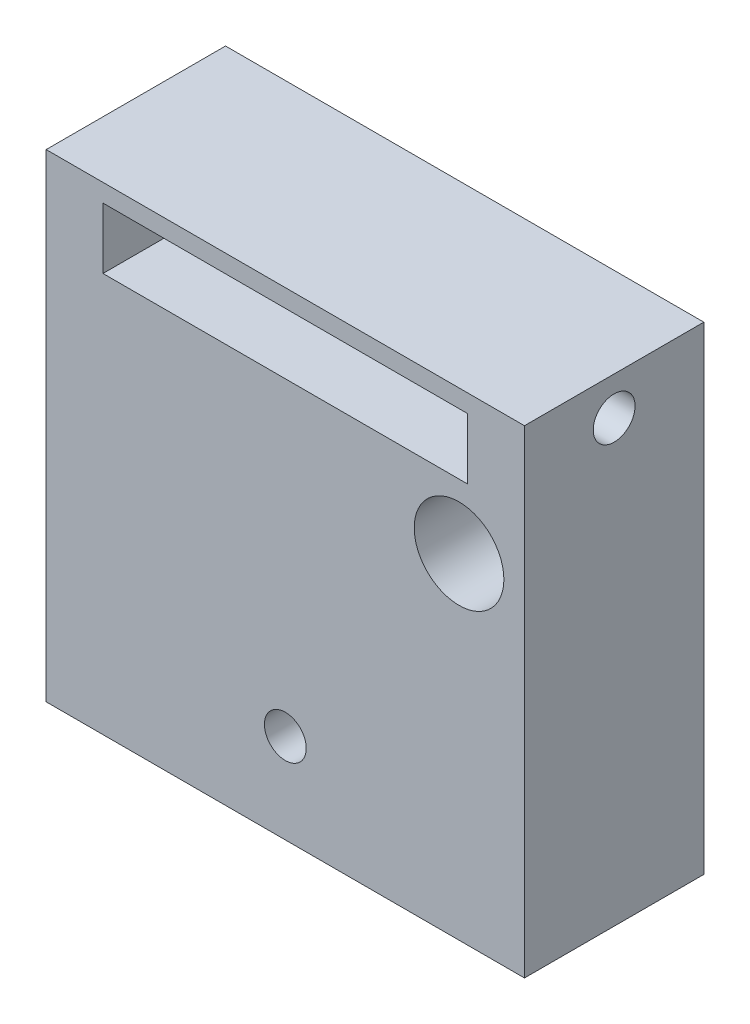
ISO-10303-21;
HEADER;
FILE_DESCRIPTION(('STEP AP214'),'2;1');
FILE_NAME('part.step','',(''),(''),'','','');
FILE_SCHEMA(('AUTOMOTIVE_DESIGN { 1 0 10303 214 1 1 1 1 }'));
ENDSEC;
DATA;
#1=APPLICATION_CONTEXT('core data for automotive mechanical design processes');
#2=APPLICATION_PROTOCOL_DEFINITION('international standard','automotive_design',2000,#1);
#3=PRODUCT_CONTEXT('',#1,'mechanical');
#4=PRODUCT('Part','Part','',(#3));
#5=PRODUCT_RELATED_PRODUCT_CATEGORY('part','',(#4));
#6=PRODUCT_DEFINITION_FORMATION('','',#4);
#7=PRODUCT_DEFINITION_CONTEXT('part definition',#1,'design');
#8=PRODUCT_DEFINITION('design','',#6,#7);
#9=PRODUCT_DEFINITION_SHAPE('','',#8);
#10=(LENGTH_UNIT() NAMED_UNIT(*) SI_UNIT(.MILLI.,.METRE.));
#11=(NAMED_UNIT(*) PLANE_ANGLE_UNIT() SI_UNIT($,.RADIAN.));
#12=(NAMED_UNIT(*) SI_UNIT($,.STERADIAN.) SOLID_ANGLE_UNIT());
#13=UNCERTAINTY_MEASURE_WITH_UNIT(LENGTH_MEASURE(1.E-05),#10,'distance_accuracy_value','');
#14=(GEOMETRIC_REPRESENTATION_CONTEXT(3) GLOBAL_UNCERTAINTY_ASSIGNED_CONTEXT((#13)) GLOBAL_UNIT_ASSIGNED_CONTEXT((#10,
#11,#12)) REPRESENTATION_CONTEXT('',''));
#15=CARTESIAN_POINT('',(0.,0.,0.));
#16=DIRECTION('',(0.,0.,1.));
#17=DIRECTION('',(1.,0.,0.));
#18=AXIS2_PLACEMENT_3D('',#15,#16,#17);
#19=CARTESIAN_POINT('',(-30.5,37.,0.));
#20=DIRECTION('',(0.,1.,0.));
#21=DIRECTION('',(0.,0.,1.));
#22=AXIS2_PLACEMENT_3D('',#19,#20,#21);
#23=PLANE('',#22);
#24=DIRECTION('',(0.,0.,1.));
#25=VECTOR('',#24,1.);
#26=CARTESIAN_POINT('',(-30.5,37.,0.));
#27=LINE('',#26,#25);
#28=CARTESIAN_POINT('',(-30.5,37.,15.904962139842));
#29=VERTEX_POINT('',#28);
#30=CARTESIAN_POINT('',(-30.5,37.,30.));
#31=VERTEX_POINT('',#30);
#32=EDGE_CURVE('E156',#29,#31,#27,.T.);
#33=ORIENTED_EDGE('',*,*,#32,.F.);
#34=DIRECTION('',(1.,0.,0.));
#35=VECTOR('',#34,1.);
#36=CARTESIAN_POINT('',(-40.,37.,15.904962139842));
#37=LINE('',#36,#35);
#38=CARTESIAN_POINT('',(30.5,37.,15.904962139842));
#39=VERTEX_POINT('',#38);
#40=EDGE_CURVE('E11',#29,#39,#37,.T.);
#41=ORIENTED_EDGE('',*,*,#40,.T.);
#42=DIRECTION('',(0.,0.,1.));
#43=VECTOR('',#42,1.);
#44=CARTESIAN_POINT('',(30.5,37.,0.));
#45=LINE('',#44,#43);
#46=CARTESIAN_POINT('',(30.5,37.,30.));
#47=VERTEX_POINT('',#46);
#48=EDGE_CURVE('E149',#39,#47,#45,.T.);
#49=ORIENTED_EDGE('',*,*,#48,.T.);
#50=DIRECTION('',(-1.,0.,0.));
#51=VECTOR('',#50,1.);
#52=CARTESIAN_POINT('',(-30.5,37.,30.));
#53=LINE('',#52,#51);
#54=EDGE_CURVE('E340',#47,#31,#53,.T.);
#55=ORIENTED_EDGE('',*,*,#54,.T.);
#56=EDGE_LOOP('',(#33,#41,#49,#55));
#57=FACE_BOUND('',#56,.T.);
#58=ADVANCED_FACE('F35',(#57),#23,.F.);
#59=CARTESIAN_POINT('',(40.,-40.,30.));
#60=DIRECTION('',(-1.,0.,0.));
#61=DIRECTION('',(0.,0.,1.));
#62=AXIS2_PLACEMENT_3D('',#59,#60,#61);
#63=PLANE('',#62);
#64=CARTESIAN_POINT('',(40.,33.6190173727964,15.));
#65=DIRECTION('',(1.,0.,0.));
#66=DIRECTION('',(0.,0.,-1.));
#67=AXIS2_PLACEMENT_3D('',#64,#65,#66);
#68=CIRCLE('',#67,3.5);
#69=CARTESIAN_POINT('',(40.,33.6190173727964,11.5));
#70=VERTEX_POINT('',#69);
#71=EDGE_CURVE('E288',#70,#70,#68,.T.);
#72=ORIENTED_EDGE('',*,*,#71,.F.);
#73=EDGE_LOOP('',(#72));
#74=FACE_BOUND('',#73,.T.);
#75=DIRECTION('',(0.,1.,0.));
#76=VECTOR('',#75,1.);
#77=CARTESIAN_POINT('',(40.,-40.,0.));
#78=LINE('',#77,#76);
#79=CARTESIAN_POINT('',(40.,-40.,0.));
#80=VERTEX_POINT('',#79);
#81=CARTESIAN_POINT('',(40.,40.,0.));
#82=VERTEX_POINT('',#81);
#83=EDGE_CURVE('E174',#80,#82,#78,.T.);
#84=ORIENTED_EDGE('',*,*,#83,.T.);
#85=DIRECTION('',(0.,0.,-1.));
#86=VECTOR('',#85,1.);
#87=CARTESIAN_POINT('',(40.,40.,30.));
#88=LINE('',#87,#86);
#89=CARTESIAN_POINT('',(40.,40.,30.));
#90=VERTEX_POINT('',#89);
#91=EDGE_CURVE('E141',#90,#82,#88,.T.);
#92=ORIENTED_EDGE('',*,*,#91,.F.);
#93=DIRECTION('',(0.,1.,0.));
#94=VECTOR('',#93,1.);
#95=CARTESIAN_POINT('',(40.,-40.,30.));
#96=LINE('',#95,#94);
#97=CARTESIAN_POINT('',(40.,-40.,30.));
#98=VERTEX_POINT('',#97);
#99=EDGE_CURVE('E163',#98,#90,#96,.T.);
#100=ORIENTED_EDGE('',*,*,#99,.F.);
#101=DIRECTION('',(0.,0.,-1.));
#102=VECTOR('',#101,1.);
#103=CARTESIAN_POINT('',(40.,-40.,30.));
#104=LINE('',#103,#102);
#105=EDGE_CURVE('E173',#98,#80,#104,.T.);
#106=ORIENTED_EDGE('',*,*,#105,.T.);
#107=EDGE_LOOP('',(#84,#92,#100,#106));
#108=FACE_BOUND('',#107,.T.);
#109=ADVANCED_FACE('F37',(#74,#108),#63,.F.);
#110=CARTESIAN_POINT('',(-40.,40.,30.));
#111=DIRECTION('',(0.,-1.,0.));
#112=DIRECTION('',(0.,0.,-1.));
#113=AXIS2_PLACEMENT_3D('',#110,#111,#112);
#114=PLANE('',#113);
#115=DIRECTION('',(-1.,0.,0.));
#116=VECTOR('',#115,1.);
#117=CARTESIAN_POINT('',(-40.,40.,0.));
#118=LINE('',#117,#116);
#119=CARTESIAN_POINT('',(-40.,40.,0.));
#120=VERTEX_POINT('',#119);
#121=EDGE_CURVE('E177',#82,#120,#118,.T.);
#122=ORIENTED_EDGE('',*,*,#121,.T.);
#123=DIRECTION('',(0.,0.,-1.));
#124=VECTOR('',#123,1.);
#125=CARTESIAN_POINT('',(-40.,40.,30.));
#126=LINE('',#125,#124);
#127=CARTESIAN_POINT('',(-40.,40.,30.));
#128=VERTEX_POINT('',#127);
#129=EDGE_CURVE('E190',#128,#120,#126,.T.);
#130=ORIENTED_EDGE('',*,*,#129,.F.);
#131=DIRECTION('',(-1.,0.,0.));
#132=VECTOR('',#131,1.);
#133=CARTESIAN_POINT('',(-40.,40.,30.));
#134=LINE('',#133,#132);
#135=EDGE_CURVE('E166',#90,#128,#134,.T.);
#136=ORIENTED_EDGE('',*,*,#135,.F.);
#137=ORIENTED_EDGE('',*,*,#91,.T.);
#138=EDGE_LOOP('',(#122,#130,#136,#137));
#139=FACE_BOUND('',#138,.T.);
#140=ADVANCED_FACE('F196',(#139),#114,.F.);
#141=CARTESIAN_POINT('',(-40.,-40.,30.));
#142=DIRECTION('',(1.,0.,0.));
#143=DIRECTION('',(0.,0.,-1.));
#144=AXIS2_PLACEMENT_3D('',#141,#142,#143);
#145=PLANE('',#144);
#146=CARTESIAN_POINT('',(-40.,33.6190173727964,15.));
#147=DIRECTION('',(1.,0.,0.));
#148=DIRECTION('',(0.,0.,-1.));
#149=AXIS2_PLACEMENT_3D('',#146,#147,#148);
#150=CIRCLE('',#149,3.5);
#151=CARTESIAN_POINT('',(-40.,33.6190173727964,11.5));
#152=VERTEX_POINT('',#151);
#153=EDGE_CURVE('E291',#152,#152,#150,.T.);
#154=ORIENTED_EDGE('',*,*,#153,.T.);
#155=EDGE_LOOP('',(#154));
#156=FACE_BOUND('',#155,.T.);
#157=DIRECTION('',(0.,-1.,0.));
#158=VECTOR('',#157,1.);
#159=CARTESIAN_POINT('',(-40.,-40.,0.));
#160=LINE('',#159,#158);
#161=CARTESIAN_POINT('',(-40.,-40.,0.));
#162=VERTEX_POINT('',#161);
#163=EDGE_CURVE('E180',#120,#162,#160,.T.);
#164=ORIENTED_EDGE('',*,*,#163,.T.);
#165=DIRECTION('',(0.,0.,-1.));
#166=VECTOR('',#165,1.);
#167=CARTESIAN_POINT('',(-40.,-40.,30.));
#168=LINE('',#167,#166);
#169=CARTESIAN_POINT('',(-40.,-40.,30.));
#170=VERTEX_POINT('',#169);
#171=EDGE_CURVE('E187',#170,#162,#168,.T.);
#172=ORIENTED_EDGE('',*,*,#171,.F.);
#173=DIRECTION('',(0.,-1.,0.));
#174=VECTOR('',#173,1.);
#175=CARTESIAN_POINT('',(-40.,-40.,30.));
#176=LINE('',#175,#174);
#177=EDGE_CURVE('E169',#128,#170,#176,.T.);
#178=ORIENTED_EDGE('',*,*,#177,.F.);
#179=ORIENTED_EDGE('',*,*,#129,.T.);
#180=EDGE_LOOP('',(#164,#172,#178,#179));
#181=FACE_BOUND('',#180,.T.);
#182=ADVANCED_FACE('F211',(#156,#181),#145,.F.);
#183=CARTESIAN_POINT('',(-40.,-40.,30.));
#184=DIRECTION('',(0.,1.,0.));
#185=DIRECTION('',(0.,0.,1.));
#186=AXIS2_PLACEMENT_3D('',#183,#184,#185);
#187=PLANE('',#186);
#188=DIRECTION('',(-1.,0.,0.));
#189=VECTOR('',#188,1.);
#190=CARTESIAN_POINT('',(20.,-40.,20.));
#191=LINE('',#190,#189);
#192=CARTESIAN_POINT('',(20.,-40.,20.));
#193=VERTEX_POINT('',#192);
#194=CARTESIAN_POINT('',(-20.,-40.,20.));
#195=VERTEX_POINT('',#194);
#196=EDGE_CURVE('E306',#193,#195,#191,.T.);
#197=ORIENTED_EDGE('',*,*,#196,.F.);
#198=DIRECTION('',(0.,0.,-1.));
#199=VECTOR('',#198,1.);
#200=CARTESIAN_POINT('',(20.,-40.,20.));
#201=LINE('',#200,#199);
#202=CARTESIAN_POINT('',(20.,-40.,0.));
#203=VERTEX_POINT('',#202);
#204=EDGE_CURVE('E316',#193,#203,#201,.T.);
#205=ORIENTED_EDGE('',*,*,#204,.T.);
#206=DIRECTION('',(1.,0.,0.));
#207=VECTOR('',#206,1.);
#208=CARTESIAN_POINT('',(-40.,-40.,0.));
#209=LINE('',#208,#207);
#210=EDGE_CURVE('E182',#203,#80,#209,.T.);
#211=ORIENTED_EDGE('',*,*,#210,.T.);
#212=ORIENTED_EDGE('',*,*,#105,.F.);
#213=DIRECTION('',(1.,0.,0.));
#214=VECTOR('',#213,1.);
#215=CARTESIAN_POINT('',(-40.,-40.,30.));
#216=LINE('',#215,#214);
#217=EDGE_CURVE('E171',#170,#98,#216,.T.);
#218=ORIENTED_EDGE('',*,*,#217,.F.);
#219=ORIENTED_EDGE('',*,*,#171,.T.);
#220=CARTESIAN_POINT('',(-20.,-40.,0.));
#221=VERTEX_POINT('',#220);
#222=EDGE_CURVE('E167',#162,#221,#209,.T.);
#223=ORIENTED_EDGE('',*,*,#222,.T.);
#224=DIRECTION('',(0.,0.,-1.));
#225=VECTOR('',#224,1.);
#226=CARTESIAN_POINT('',(-20.,-40.,20.));
#227=LINE('',#226,#225);
#228=EDGE_CURVE('E58',#195,#221,#227,.T.);
#229=ORIENTED_EDGE('',*,*,#228,.F.);
#230=EDGE_LOOP('',(#197,#205,#211,#212,#218,#219,#223,#229));
#231=FACE_BOUND('',#230,.T.);
#232=ADVANCED_FACE('F216',(#231),#187,.F.);
#233=CARTESIAN_POINT('',(0.,0.,30.));
#234=DIRECTION('',(0.,0.,-1.));
#235=DIRECTION('',(-1.,0.,0.));
#236=AXIS2_PLACEMENT_3D('',#233,#234,#235);
#237=PLANE('',#236);
#238=CARTESIAN_POINT('',(29.0563125975893,16.,30.));
#239=DIRECTION('',(0.,0.,1.));
#240=DIRECTION('',(1.,0.,0.));
#241=AXIS2_PLACEMENT_3D('',#238,#239,#240);
#242=CIRCLE('',#241,7.5);
#243=CARTESIAN_POINT('',(36.5563125975893,16.,30.));
#244=VERTEX_POINT('',#243);
#245=EDGE_CURVE('E286',#244,#244,#242,.T.);
#246=ORIENTED_EDGE('',*,*,#245,.F.);
#247=EDGE_LOOP('',(#246));
#248=FACE_BOUND('',#247,.T.);
#249=CARTESIAN_POINT('',(0.,-25.,30.));
#250=DIRECTION('',(0.,0.,-1.));
#251=DIRECTION('',(-1.,0.,0.));
#252=AXIS2_PLACEMENT_3D('',#249,#250,#251);
#253=CIRCLE('',#252,3.5);
#254=CARTESIAN_POINT('',(-3.49999999999999,-25.,30.));
#255=VERTEX_POINT('',#254);
#256=EDGE_CURVE('E297',#255,#255,#253,.T.);
#257=ORIENTED_EDGE('',*,*,#256,.T.);
#258=EDGE_LOOP('',(#257));
#259=FACE_BOUND('',#258,.T.);
#260=ORIENTED_EDGE('',*,*,#54,.F.);
#261=DIRECTION('',(0.,1.,0.));
#262=VECTOR('',#261,1.);
#263=CARTESIAN_POINT('',(30.5,26.8,30.));
#264=LINE('',#263,#262);
#265=CARTESIAN_POINT('',(30.5,26.8,30.));
#266=VERTEX_POINT('',#265);
#267=EDGE_CURVE('E324',#266,#47,#264,.T.);
#268=ORIENTED_EDGE('',*,*,#267,.F.);
#269=DIRECTION('',(1.,0.,0.));
#270=VECTOR('',#269,1.);
#271=CARTESIAN_POINT('',(-30.5,26.8,30.));
#272=LINE('',#271,#270);
#273=CARTESIAN_POINT('',(-30.5,26.8,30.));
#274=VERTEX_POINT('',#273);
#275=EDGE_CURVE('E332',#274,#266,#272,.T.);
#276=ORIENTED_EDGE('',*,*,#275,.F.);
#277=DIRECTION('',(0.,-1.,0.));
#278=VECTOR('',#277,1.);
#279=CARTESIAN_POINT('',(-30.5,26.8,30.));
#280=LINE('',#279,#278);
#281=EDGE_CURVE('E343',#31,#274,#280,.T.);
#282=ORIENTED_EDGE('',*,*,#281,.F.);
#283=EDGE_LOOP('',(#260,#268,#276,#282));
#284=FACE_BOUND('',#283,.T.);
#285=ORIENTED_EDGE('',*,*,#99,.T.);
#286=ORIENTED_EDGE('',*,*,#135,.T.);
#287=ORIENTED_EDGE('',*,*,#177,.T.);
#288=ORIENTED_EDGE('',*,*,#217,.T.);
#289=EDGE_LOOP('',(#285,#286,#287,#288));
#290=FACE_BOUND('',#289,.T.);
#291=ADVANCED_FACE('F218',(#248,#259,#284,#290),#237,.F.);
#292=CARTESIAN_POINT('',(0.,0.,0.));
#293=DIRECTION('',(0.,0.,-1.));
#294=DIRECTION('',(-1.,0.,0.));
#295=AXIS2_PLACEMENT_3D('',#292,#293,#294);
#296=PLANE('',#295);
#297=CARTESIAN_POINT('',(29.0563125975893,16.,0.));
#298=DIRECTION('',(0.,0.,1.));
#299=DIRECTION('',(1.,0.,0.));
#300=AXIS2_PLACEMENT_3D('',#297,#298,#299);
#301=CIRCLE('',#300,7.5);
#302=CARTESIAN_POINT('',(36.5563125975893,16.,0.));
#303=VERTEX_POINT('',#302);
#304=EDGE_CURVE('E284',#303,#303,#301,.T.);
#305=ORIENTED_EDGE('',*,*,#304,.T.);
#306=EDGE_LOOP('',(#305));
#307=FACE_BOUND('',#306,.T.);
#308=DIRECTION('',(0.,-1.,0.));
#309=VECTOR('',#308,1.);
#310=CARTESIAN_POINT('',(20.,-40.,0.));
#311=LINE('',#310,#309);
#312=CARTESIAN_POINT('',(20.,-15.,0.));
#313=VERTEX_POINT('',#312);
#314=EDGE_CURVE('E300',#313,#203,#311,.T.);
#315=ORIENTED_EDGE('',*,*,#314,.F.);
#316=DIRECTION('',(1.,0.,0.));
#317=VECTOR('',#316,1.);
#318=CARTESIAN_POINT('',(20.,-15.,0.));
#319=LINE('',#318,#317);
#320=CARTESIAN_POINT('',(-20.,-15.,0.));
#321=VERTEX_POINT('',#320);
#322=EDGE_CURVE('E307',#321,#313,#319,.T.);
#323=ORIENTED_EDGE('',*,*,#322,.F.);
#324=DIRECTION('',(0.,1.,0.));
#325=VECTOR('',#324,1.);
#326=CARTESIAN_POINT('',(-20.,-40.,0.));
#327=LINE('',#326,#325);
#328=EDGE_CURVE('E318',#221,#321,#327,.T.);
#329=ORIENTED_EDGE('',*,*,#328,.F.);
#330=ORIENTED_EDGE('',*,*,#222,.F.);
#331=ORIENTED_EDGE('',*,*,#163,.F.);
#332=ORIENTED_EDGE('',*,*,#121,.F.);
#333=ORIENTED_EDGE('',*,*,#83,.F.);
#334=ORIENTED_EDGE('',*,*,#210,.F.);
#335=EDGE_LOOP('',(#315,#323,#329,#330,#331,#332,#333,#334));
#336=FACE_BOUND('',#335,.T.);
#337=DIRECTION('',(0.,1.,0.));
#338=VECTOR('',#337,1.);
#339=CARTESIAN_POINT('',(30.5,26.8,0.));
#340=LINE('',#339,#338);
#341=CARTESIAN_POINT('',(30.5,26.8,0.));
#342=VERTEX_POINT('',#341);
#343=CARTESIAN_POINT('',(30.5,37.,0.));
#344=VERTEX_POINT('',#343);
#345=EDGE_CURVE('E330',#342,#344,#340,.T.);
#346=ORIENTED_EDGE('',*,*,#345,.T.);
#347=DIRECTION('',(-1.,0.,0.));
#348=VECTOR('',#347,1.);
#349=CARTESIAN_POINT('',(-30.5,37.,0.));
#350=LINE('',#349,#348);
#351=CARTESIAN_POINT('',(-30.5,37.,0.));
#352=VERTEX_POINT('',#351);
#353=EDGE_CURVE('E154',#344,#352,#350,.T.);
#354=ORIENTED_EDGE('',*,*,#353,.T.);
#355=DIRECTION('',(0.,-1.,0.));
#356=VECTOR('',#355,1.);
#357=CARTESIAN_POINT('',(-30.5,26.8,0.));
#358=LINE('',#357,#356);
#359=CARTESIAN_POINT('',(-30.5,26.8,0.));
#360=VERTEX_POINT('',#359);
#361=EDGE_CURVE('E334',#352,#360,#358,.T.);
#362=ORIENTED_EDGE('',*,*,#361,.T.);
#363=DIRECTION('',(1.,0.,0.));
#364=VECTOR('',#363,1.);
#365=CARTESIAN_POINT('',(-30.5,26.8,0.));
#366=LINE('',#365,#364);
#367=EDGE_CURVE('E160',#360,#342,#366,.T.);
#368=ORIENTED_EDGE('',*,*,#367,.T.);
#369=EDGE_LOOP('',(#346,#354,#362,#368));
#370=FACE_BOUND('',#369,.T.);
#371=ADVANCED_FACE('F205',(#307,#336,#370),#296,.T.);
#372=CARTESIAN_POINT('',(30.5,26.8,0.));
#373=DIRECTION('',(1.,0.,0.));
#374=DIRECTION('',(0.,0.,-1.));
#375=AXIS2_PLACEMENT_3D('',#372,#373,#374);
#376=PLANE('',#375);
#377=ORIENTED_EDGE('',*,*,#48,.F.);
#378=CARTESIAN_POINT('',(30.5,33.6190173727964,15.));
#379=DIRECTION('',(1.,0.,0.));
#380=DIRECTION('',(0.,0.,-1.));
#381=AXIS2_PLACEMENT_3D('',#378,#379,#380);
#382=CIRCLE('',#381,3.5);
#383=CARTESIAN_POINT('',(30.5,37.,14.095037860158));
#384=VERTEX_POINT('',#383);
#385=EDGE_CURVE('E136',#39,#384,#382,.T.);
#386=ORIENTED_EDGE('',*,*,#385,.T.);
#387=EDGE_CURVE('E146',#344,#384,#45,.T.);
#388=ORIENTED_EDGE('',*,*,#387,.F.);
#389=ORIENTED_EDGE('',*,*,#345,.F.);
#390=DIRECTION('',(0.,0.,1.));
#391=VECTOR('',#390,1.);
#392=CARTESIAN_POINT('',(30.5,26.8,0.));
#393=LINE('',#392,#391);
#394=EDGE_CURVE('E178',#342,#266,#393,.T.);
#395=ORIENTED_EDGE('',*,*,#394,.T.);
#396=ORIENTED_EDGE('',*,*,#267,.T.);
#397=EDGE_LOOP('',(#377,#386,#388,#389,#395,#396));
#398=FACE_BOUND('',#397,.T.);
#399=ADVANCED_FACE('F144',(#398),#376,.F.);
#400=CARTESIAN_POINT('',(-30.5,26.8,0.));
#401=DIRECTION('',(0.,-1.,0.));
#402=DIRECTION('',(0.,0.,-1.));
#403=AXIS2_PLACEMENT_3D('',#400,#401,#402);
#404=PLANE('',#403);
#405=ORIENTED_EDGE('',*,*,#275,.T.);
#406=ORIENTED_EDGE('',*,*,#394,.F.);
#407=ORIENTED_EDGE('',*,*,#367,.F.);
#408=DIRECTION('',(0.,0.,1.));
#409=VECTOR('',#408,1.);
#410=CARTESIAN_POINT('',(-30.5,26.8,0.));
#411=LINE('',#410,#409);
#412=EDGE_CURVE('E348',#360,#274,#411,.T.);
#413=ORIENTED_EDGE('',*,*,#412,.T.);
#414=EDGE_LOOP('',(#405,#406,#407,#413));
#415=FACE_BOUND('',#414,.T.);
#416=ADVANCED_FACE('F251',(#415),#404,.F.);
#417=CARTESIAN_POINT('',(-30.5,26.8,0.));
#418=DIRECTION('',(-1.,0.,0.));
#419=DIRECTION('',(0.,0.,1.));
#420=AXIS2_PLACEMENT_3D('',#417,#418,#419);
#421=PLANE('',#420);
#422=CARTESIAN_POINT('',(-30.5,37.,14.095037860158));
#423=VERTEX_POINT('',#422);
#424=EDGE_CURVE('E158',#352,#423,#27,.T.);
#425=ORIENTED_EDGE('',*,*,#424,.T.);
#426=CARTESIAN_POINT('',(-30.5,33.6190173727964,15.));
#427=DIRECTION('',(-1.,0.,0.));
#428=DIRECTION('',(0.,0.,1.));
#429=AXIS2_PLACEMENT_3D('',#426,#427,#428);
#430=CIRCLE('',#429,3.5);
#431=EDGE_CURVE('E50',#423,#29,#430,.T.);
#432=ORIENTED_EDGE('',*,*,#431,.T.);
#433=ORIENTED_EDGE('',*,*,#32,.T.);
#434=ORIENTED_EDGE('',*,*,#281,.T.);
#435=ORIENTED_EDGE('',*,*,#412,.F.);
#436=ORIENTED_EDGE('',*,*,#361,.F.);
#437=EDGE_LOOP('',(#425,#432,#433,#434,#435,#436));
#438=FACE_BOUND('',#437,.T.);
#439=ADVANCED_FACE('F243',(#438),#421,.F.);
#440=ORIENTED_EDGE('',*,*,#387,.T.);
#441=DIRECTION('',(1.,0.,0.));
#442=VECTOR('',#441,1.);
#443=CARTESIAN_POINT('',(-40.,37.,14.095037860158));
#444=LINE('',#443,#442);
#445=EDGE_CURVE('E43',#384,#423,#444,.F.);
#446=ORIENTED_EDGE('',*,*,#445,.T.);
#447=ORIENTED_EDGE('',*,*,#424,.F.);
#448=ORIENTED_EDGE('',*,*,#353,.F.);
#449=EDGE_LOOP('',(#440,#446,#447,#448));
#450=FACE_BOUND('',#449,.T.);
#451=ADVANCED_FACE('F152',(#450),#23,.F.);
#452=CARTESIAN_POINT('',(20.,-40.,20.));
#453=DIRECTION('',(1.,0.,0.));
#454=DIRECTION('',(0.,1.,0.));
#455=AXIS2_PLACEMENT_3D('',#452,#453,#454);
#456=PLANE('',#455);
#457=ORIENTED_EDGE('',*,*,#314,.T.);
#458=ORIENTED_EDGE('',*,*,#204,.F.);
#459=DIRECTION('',(0.,-1.,0.));
#460=VECTOR('',#459,1.);
#461=CARTESIAN_POINT('',(20.,-40.,20.));
#462=LINE('',#461,#460);
#463=CARTESIAN_POINT('',(20.,-15.,20.));
#464=VERTEX_POINT('',#463);
#465=EDGE_CURVE('E303',#464,#193,#462,.T.);
#466=ORIENTED_EDGE('',*,*,#465,.F.);
#467=DIRECTION('',(0.,0.,-1.));
#468=VECTOR('',#467,1.);
#469=CARTESIAN_POINT('',(20.,-15.,20.));
#470=LINE('',#469,#468);
#471=EDGE_CURVE('E322',#464,#313,#470,.T.);
#472=ORIENTED_EDGE('',*,*,#471,.T.);
#473=EDGE_LOOP('',(#457,#458,#466,#472));
#474=FACE_BOUND('',#473,.T.);
#475=ADVANCED_FACE('F242',(#474),#456,.F.);
#476=CARTESIAN_POINT('',(20.,-15.,20.));
#477=DIRECTION('',(0.,1.,0.));
#478=DIRECTION('',(0.,0.,1.));
#479=AXIS2_PLACEMENT_3D('',#476,#477,#478);
#480=PLANE('',#479);
#481=ORIENTED_EDGE('',*,*,#322,.T.);
#482=ORIENTED_EDGE('',*,*,#471,.F.);
#483=DIRECTION('',(1.,0.,0.));
#484=VECTOR('',#483,1.);
#485=CARTESIAN_POINT('',(20.,-15.,20.));
#486=LINE('',#485,#484);
#487=CARTESIAN_POINT('',(-20.,-15.,20.));
#488=VERTEX_POINT('',#487);
#489=EDGE_CURVE('E313',#488,#464,#486,.T.);
#490=ORIENTED_EDGE('',*,*,#489,.F.);
#491=DIRECTION('',(0.,0.,-1.));
#492=VECTOR('',#491,1.);
#493=CARTESIAN_POINT('',(-20.,-15.,20.));
#494=LINE('',#493,#492);
#495=EDGE_CURVE('E325',#488,#321,#494,.T.);
#496=ORIENTED_EDGE('',*,*,#495,.T.);
#497=EDGE_LOOP('',(#481,#482,#490,#496));
#498=FACE_BOUND('',#497,.T.);
#499=ADVANCED_FACE('F248',(#498),#480,.F.);
#500=CARTESIAN_POINT('',(-20.,-40.,20.));
#501=DIRECTION('',(-1.,0.,0.));
#502=DIRECTION('',(0.,-1.,0.));
#503=AXIS2_PLACEMENT_3D('',#500,#501,#502);
#504=PLANE('',#503);
#505=ORIENTED_EDGE('',*,*,#328,.T.);
#506=ORIENTED_EDGE('',*,*,#495,.F.);
#507=DIRECTION('',(0.,1.,0.));
#508=VECTOR('',#507,1.);
#509=CARTESIAN_POINT('',(-20.,-40.,20.));
#510=LINE('',#509,#508);
#511=EDGE_CURVE('E310',#195,#488,#510,.T.);
#512=ORIENTED_EDGE('',*,*,#511,.F.);
#513=ORIENTED_EDGE('',*,*,#228,.T.);
#514=EDGE_LOOP('',(#505,#506,#512,#513));
#515=FACE_BOUND('',#514,.T.);
#516=ADVANCED_FACE('F259',(#515),#504,.F.);
#517=CARTESIAN_POINT('',(0.,0.,20.));
#518=DIRECTION('',(0.,0.,1.));
#519=DIRECTION('',(1.,0.,0.));
#520=AXIS2_PLACEMENT_3D('',#517,#518,#519);
#521=PLANE('',#520);
#522=CARTESIAN_POINT('',(0.,-25.,20.));
#523=DIRECTION('',(0.,0.,-1.));
#524=DIRECTION('',(-1.,0.,0.));
#525=AXIS2_PLACEMENT_3D('',#522,#523,#524);
#526=CIRCLE('',#525,3.5);
#527=CARTESIAN_POINT('',(-3.49999999999999,-25.,20.));
#528=VERTEX_POINT('',#527);
#529=EDGE_CURVE('E150',#528,#528,#526,.T.);
#530=ORIENTED_EDGE('',*,*,#529,.F.);
#531=EDGE_LOOP('',(#530));
#532=FACE_BOUND('',#531,.T.);
#533=ORIENTED_EDGE('',*,*,#465,.T.);
#534=ORIENTED_EDGE('',*,*,#196,.T.);
#535=ORIENTED_EDGE('',*,*,#511,.T.);
#536=ORIENTED_EDGE('',*,*,#489,.T.);
#537=EDGE_LOOP('',(#533,#534,#535,#536));
#538=FACE_BOUND('',#537,.T.);
#539=ADVANCED_FACE('F262',(#532,#538),#521,.F.);
#540=CARTESIAN_POINT('',(0.,-25.,30.));
#541=DIRECTION('',(0.,0.,-1.));
#542=DIRECTION('',(-1.,0.,0.));
#543=AXIS2_PLACEMENT_3D('',#540,#541,#542);
#544=CYLINDRICAL_SURFACE('',#543,3.5);
#545=ORIENTED_EDGE('',*,*,#256,.F.);
#546=EDGE_LOOP('',(#545));
#547=FACE_BOUND('',#546,.T.);
#548=ORIENTED_EDGE('',*,*,#529,.T.);
#549=EDGE_LOOP('',(#548));
#550=FACE_BOUND('',#549,.T.);
#551=ADVANCED_FACE('F268',(#547,#550),#544,.F.);
#552=CARTESIAN_POINT('',(-40.,33.6190173727964,15.));
#553=DIRECTION('',(1.,0.,0.));
#554=DIRECTION('',(0.,0.,-1.));
#555=AXIS2_PLACEMENT_3D('',#552,#553,#554);
#556=CYLINDRICAL_SURFACE('',#555,3.5);
#557=ORIENTED_EDGE('',*,*,#71,.T.);
#558=EDGE_LOOP('',(#557));
#559=FACE_BOUND('',#558,.T.);
#560=ORIENTED_EDGE('',*,*,#153,.F.);
#561=EDGE_LOOP('',(#560));
#562=FACE_BOUND('',#561,.T.);
#563=ORIENTED_EDGE('',*,*,#431,.F.);
#564=ORIENTED_EDGE('',*,*,#445,.F.);
#565=ORIENTED_EDGE('',*,*,#385,.F.);
#566=ORIENTED_EDGE('',*,*,#40,.F.);
#567=EDGE_LOOP('',(#563,#564,#565,#566));
#568=FACE_BOUND('',#567,.T.);
#569=ADVANCED_FACE('F135',(#559,#562,#568),#556,.F.);
#570=CARTESIAN_POINT('',(29.0563125975893,16.,0.));
#571=DIRECTION('',(0.,0.,1.));
#572=DIRECTION('',(1.,0.,0.));
#573=AXIS2_PLACEMENT_3D('',#570,#571,#572);
#574=CYLINDRICAL_SURFACE('',#573,7.5);
#575=ORIENTED_EDGE('',*,*,#304,.F.);
#576=EDGE_LOOP('',(#575));
#577=FACE_BOUND('',#576,.T.);
#578=ORIENTED_EDGE('',*,*,#245,.T.);
#579=EDGE_LOOP('',(#578));
#580=FACE_BOUND('',#579,.T.);
#581=ADVANCED_FACE('F275',(#577,#580),#574,.F.);
#582=CLOSED_SHELL('',(#58,#109,#140,#182,#232,#291,#371,#399,#416,#439,#451,#475,#499,#516,#539,
#551,#569,#581));
#583=MANIFOLD_SOLID_BREP('B2',#582);
#584=ADVANCED_BREP_SHAPE_REPRESENTATION('',(#18,#583),#14);
#585=SHAPE_DEFINITION_REPRESENTATION(#9,#584);
ENDSEC;
END-ISO-10303-21;
